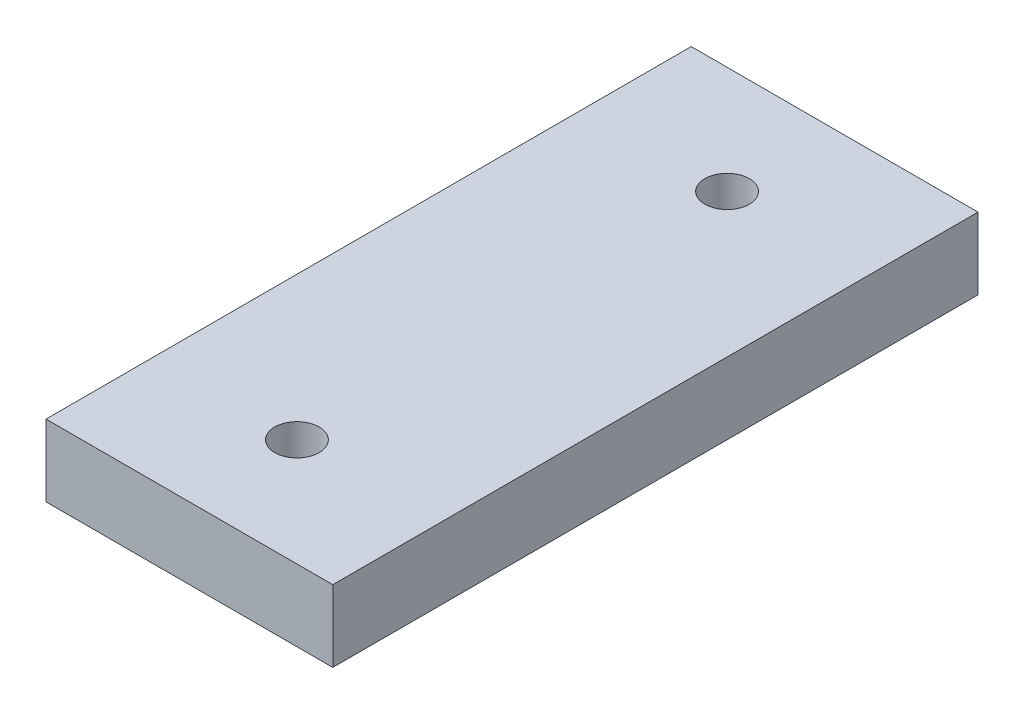
ISO-10303-21;
HEADER;
FILE_DESCRIPTION(('STEP AP214'),'2;1');
FILE_NAME('part.step','',(''),(''),'','','');
FILE_SCHEMA(('AUTOMOTIVE_DESIGN { 1 0 10303 214 1 1 1 1 }'));
ENDSEC;
DATA;
#1=APPLICATION_CONTEXT('core data for automotive mechanical design processes');
#2=APPLICATION_PROTOCOL_DEFINITION('international standard','automotive_design',2000,#1);
#3=PRODUCT_CONTEXT('',#1,'mechanical');
#4=PRODUCT('Part','Part','',(#3));
#5=PRODUCT_RELATED_PRODUCT_CATEGORY('part','',(#4));
#6=PRODUCT_DEFINITION_FORMATION('','',#4);
#7=PRODUCT_DEFINITION_CONTEXT('part definition',#1,'design');
#8=PRODUCT_DEFINITION('design','',#6,#7);
#9=PRODUCT_DEFINITION_SHAPE('','',#8);
#10=(LENGTH_UNIT() NAMED_UNIT(*) SI_UNIT(.MILLI.,.METRE.));
#11=(NAMED_UNIT(*) PLANE_ANGLE_UNIT() SI_UNIT($,.RADIAN.));
#12=(NAMED_UNIT(*) SI_UNIT($,.STERADIAN.) SOLID_ANGLE_UNIT());
#13=UNCERTAINTY_MEASURE_WITH_UNIT(LENGTH_MEASURE(1.E-05),#10,'distance_accuracy_value','');
#14=(GEOMETRIC_REPRESENTATION_CONTEXT(3) GLOBAL_UNCERTAINTY_ASSIGNED_CONTEXT((#13)) GLOBAL_UNIT_ASSIGNED_CONTEXT((#10,
#11,#12)) REPRESENTATION_CONTEXT('',''));
#15=CARTESIAN_POINT('',(0.,0.,0.));
#16=DIRECTION('',(0.,0.,1.));
#17=DIRECTION('',(1.,0.,0.));
#18=AXIS2_PLACEMENT_3D('',#15,#16,#17);
#19=CARTESIAN_POINT('',(10.,5.,22.5));
#20=DIRECTION('',(-1.,0.,0.));
#21=DIRECTION('',(0.,0.,1.));
#22=AXIS2_PLACEMENT_3D('',#19,#20,#21);
#23=PLANE('',#22);
#24=DIRECTION('',(0.,0.,-1.));
#25=VECTOR('',#24,1.);
#26=CARTESIAN_POINT('',(10.,0.,22.5));
#27=LINE('',#26,#25);
#28=CARTESIAN_POINT('',(10.,0.,22.5));
#29=VERTEX_POINT('',#28);
#30=CARTESIAN_POINT('',(10.,0.,-22.5));
#31=VERTEX_POINT('',#30);
#32=EDGE_CURVE('E97',#29,#31,#27,.T.);
#33=ORIENTED_EDGE('',*,*,#32,.T.);
#34=DIRECTION('',(0.,-1.,0.));
#35=VECTOR('',#34,1.);
#36=CARTESIAN_POINT('',(10.,5.,-22.5));
#37=LINE('',#36,#35);
#38=CARTESIAN_POINT('',(10.,5.,-22.5));
#39=VERTEX_POINT('',#38);
#40=EDGE_CURVE('E11',#39,#31,#37,.T.);
#41=ORIENTED_EDGE('',*,*,#40,.F.);
#42=DIRECTION('',(0.,0.,-1.));
#43=VECTOR('',#42,1.);
#44=CARTESIAN_POINT('',(10.,5.,22.5));
#45=LINE('',#44,#43);
#46=CARTESIAN_POINT('',(10.,5.,22.5));
#47=VERTEX_POINT('',#46);
#48=EDGE_CURVE('E85',#47,#39,#45,.T.);
#49=ORIENTED_EDGE('',*,*,#48,.F.);
#50=DIRECTION('',(0.,-1.,0.));
#51=VECTOR('',#50,1.);
#52=CARTESIAN_POINT('',(10.,5.,22.5));
#53=LINE('',#52,#51);
#54=EDGE_CURVE('E93',#47,#29,#53,.T.);
#55=ORIENTED_EDGE('',*,*,#54,.T.);
#56=EDGE_LOOP('',(#33,#41,#49,#55));
#57=FACE_BOUND('',#56,.T.);
#58=ADVANCED_FACE('F34',(#57),#23,.F.);
#59=CARTESIAN_POINT('',(-10.,5.,-22.5));
#60=DIRECTION('',(0.,0.,1.));
#61=DIRECTION('',(1.,0.,0.));
#62=AXIS2_PLACEMENT_3D('',#59,#60,#61);
#63=PLANE('',#62);
#64=DIRECTION('',(-1.,0.,0.));
#65=VECTOR('',#64,1.);
#66=CARTESIAN_POINT('',(-10.,0.,-22.5));
#67=LINE('',#66,#65);
#68=CARTESIAN_POINT('',(-10.,0.,-22.5));
#69=VERTEX_POINT('',#68);
#70=EDGE_CURVE('E89',#31,#69,#67,.T.);
#71=ORIENTED_EDGE('',*,*,#70,.T.);
#72=DIRECTION('',(0.,-1.,0.));
#73=VECTOR('',#72,1.);
#74=CARTESIAN_POINT('',(-10.,5.,-22.5));
#75=LINE('',#74,#73);
#76=CARTESIAN_POINT('',(-10.,5.,-22.5));
#77=VERTEX_POINT('',#76);
#78=EDGE_CURVE('E42',#77,#69,#75,.T.);
#79=ORIENTED_EDGE('',*,*,#78,.F.);
#80=DIRECTION('',(-1.,0.,0.));
#81=VECTOR('',#80,1.);
#82=CARTESIAN_POINT('',(-10.,5.,-22.5));
#83=LINE('',#82,#81);
#84=EDGE_CURVE('E80',#39,#77,#83,.T.);
#85=ORIENTED_EDGE('',*,*,#84,.F.);
#86=ORIENTED_EDGE('',*,*,#40,.T.);
#87=EDGE_LOOP('',(#71,#79,#85,#86));
#88=FACE_BOUND('',#87,.T.);
#89=ADVANCED_FACE('F88',(#88),#63,.F.);
#90=CARTESIAN_POINT('',(-10.,5.,22.5));
#91=DIRECTION('',(1.,0.,0.));
#92=DIRECTION('',(0.,0.,-1.));
#93=AXIS2_PLACEMENT_3D('',#90,#91,#92);
#94=PLANE('',#93);
#95=DIRECTION('',(0.,0.,1.));
#96=VECTOR('',#95,1.);
#97=CARTESIAN_POINT('',(-10.,0.,22.5));
#98=LINE('',#97,#96);
#99=CARTESIAN_POINT('',(-10.,0.,22.5));
#100=VERTEX_POINT('',#99);
#101=EDGE_CURVE('E67',#69,#100,#98,.T.);
#102=ORIENTED_EDGE('',*,*,#101,.T.);
#103=DIRECTION('',(0.,-1.,0.));
#104=VECTOR('',#103,1.);
#105=CARTESIAN_POINT('',(-10.,5.,22.5));
#106=LINE('',#105,#104);
#107=CARTESIAN_POINT('',(-10.,5.,22.5));
#108=VERTEX_POINT('',#107);
#109=EDGE_CURVE('E90',#108,#100,#106,.T.);
#110=ORIENTED_EDGE('',*,*,#109,.F.);
#111=DIRECTION('',(0.,0.,1.));
#112=VECTOR('',#111,1.);
#113=CARTESIAN_POINT('',(-10.,5.,22.5));
#114=LINE('',#113,#112);
#115=EDGE_CURVE('E83',#77,#108,#114,.T.);
#116=ORIENTED_EDGE('',*,*,#115,.F.);
#117=ORIENTED_EDGE('',*,*,#78,.T.);
#118=EDGE_LOOP('',(#102,#110,#116,#117));
#119=FACE_BOUND('',#118,.T.);
#120=ADVANCED_FACE('F91',(#119),#94,.F.);
#121=CARTESIAN_POINT('',(-10.,5.,22.5));
#122=DIRECTION('',(0.,0.,-1.));
#123=DIRECTION('',(-1.,0.,0.));
#124=AXIS2_PLACEMENT_3D('',#121,#122,#123);
#125=PLANE('',#124);
#126=DIRECTION('',(1.,0.,0.));
#127=VECTOR('',#126,1.);
#128=CARTESIAN_POINT('',(-10.,0.,22.5));
#129=LINE('',#128,#127);
#130=EDGE_CURVE('E73',#100,#29,#129,.T.);
#131=ORIENTED_EDGE('',*,*,#130,.T.);
#132=ORIENTED_EDGE('',*,*,#54,.F.);
#133=DIRECTION('',(1.,0.,0.));
#134=VECTOR('',#133,1.);
#135=CARTESIAN_POINT('',(-10.,5.,22.5));
#136=LINE('',#135,#134);
#137=EDGE_CURVE('E50',#108,#47,#136,.T.);
#138=ORIENTED_EDGE('',*,*,#137,.F.);
#139=ORIENTED_EDGE('',*,*,#109,.T.);
#140=EDGE_LOOP('',(#131,#132,#138,#139));
#141=FACE_BOUND('',#140,.T.);
#142=ADVANCED_FACE('F105',(#141),#125,.F.);
#143=CARTESIAN_POINT('',(0.,5.,0.));
#144=DIRECTION('',(0.,-1.,0.));
#145=DIRECTION('',(0.,0.,-1.));
#146=AXIS2_PLACEMENT_3D('',#143,#144,#145);
#147=PLANE('',#146);
#148=CARTESIAN_POINT('',(0.,5.,-15.));
#149=DIRECTION('',(0.,1.,0.));
#150=DIRECTION('',(0.,0.,1.));
#151=AXIS2_PLACEMENT_3D('',#148,#149,#150);
#152=CIRCLE('',#151,1.55);
#153=CARTESIAN_POINT('',(0.,5.,-13.45));
#154=VERTEX_POINT('',#153);
#155=EDGE_CURVE('E117',#154,#154,#152,.T.);
#156=ORIENTED_EDGE('',*,*,#155,.F.);
#157=EDGE_LOOP('',(#156));
#158=FACE_BOUND('',#157,.T.);
#159=CARTESIAN_POINT('',(0.,5.,15.));
#160=DIRECTION('',(0.,1.,0.));
#161=DIRECTION('',(0.,0.,-1.));
#162=AXIS2_PLACEMENT_3D('',#159,#160,#161);
#163=CIRCLE('',#162,1.55);
#164=CARTESIAN_POINT('',(0.,5.,13.45));
#165=VERTEX_POINT('',#164);
#166=EDGE_CURVE('E111',#165,#165,#163,.T.);
#167=ORIENTED_EDGE('',*,*,#166,.F.);
#168=EDGE_LOOP('',(#167));
#169=FACE_BOUND('',#168,.T.);
#170=ORIENTED_EDGE('',*,*,#48,.T.);
#171=ORIENTED_EDGE('',*,*,#84,.T.);
#172=ORIENTED_EDGE('',*,*,#115,.T.);
#173=ORIENTED_EDGE('',*,*,#137,.T.);
#174=EDGE_LOOP('',(#170,#171,#172,#173));
#175=FACE_BOUND('',#174,.T.);
#176=ADVANCED_FACE('F81',(#158,#169,#175),#147,.F.);
#177=CARTESIAN_POINT('',(0.,0.,0.));
#178=DIRECTION('',(0.,-1.,0.));
#179=DIRECTION('',(0.,0.,-1.));
#180=AXIS2_PLACEMENT_3D('',#177,#178,#179);
#181=PLANE('',#180);
#182=CARTESIAN_POINT('',(0.,0.,-15.));
#183=DIRECTION('',(0.,1.,0.));
#184=DIRECTION('',(0.,0.,1.));
#185=AXIS2_PLACEMENT_3D('',#182,#183,#184);
#186=CIRCLE('',#185,1.55);
#187=CARTESIAN_POINT('',(0.,0.,-13.45));
#188=VERTEX_POINT('',#187);
#189=EDGE_CURVE('E100',#188,#188,#186,.T.);
#190=ORIENTED_EDGE('',*,*,#189,.T.);
#191=EDGE_LOOP('',(#190));
#192=FACE_BOUND('',#191,.T.);
#193=CARTESIAN_POINT('',(0.,0.,15.));
#194=DIRECTION('',(0.,1.,0.));
#195=DIRECTION('',(0.,0.,-1.));
#196=AXIS2_PLACEMENT_3D('',#193,#194,#195);
#197=CIRCLE('',#196,1.55);
#198=CARTESIAN_POINT('',(0.,0.,13.45));
#199=VERTEX_POINT('',#198);
#200=EDGE_CURVE('E114',#199,#199,#197,.T.);
#201=ORIENTED_EDGE('',*,*,#200,.T.);
#202=EDGE_LOOP('',(#201));
#203=FACE_BOUND('',#202,.T.);
#204=ORIENTED_EDGE('',*,*,#32,.F.);
#205=ORIENTED_EDGE('',*,*,#130,.F.);
#206=ORIENTED_EDGE('',*,*,#101,.F.);
#207=ORIENTED_EDGE('',*,*,#70,.F.);
#208=EDGE_LOOP('',(#204,#205,#206,#207));
#209=FACE_BOUND('',#208,.T.);
#210=ADVANCED_FACE('F108',(#192,#203,#209),#181,.T.);
#211=CARTESIAN_POINT('',(0.,0.,15.));
#212=DIRECTION('',(0.,1.,0.));
#213=DIRECTION('',(0.,0.,1.));
#214=AXIS2_PLACEMENT_3D('',#211,#212,#213);
#215=CYLINDRICAL_SURFACE('',#214,1.55);
#216=ORIENTED_EDGE('',*,*,#200,.F.);
#217=EDGE_LOOP('',(#216));
#218=FACE_BOUND('',#217,.T.);
#219=ORIENTED_EDGE('',*,*,#166,.T.);
#220=EDGE_LOOP('',(#219));
#221=FACE_BOUND('',#220,.T.);
#222=ADVANCED_FACE('F128',(#218,#221),#215,.F.);
#223=CARTESIAN_POINT('',(0.,0.,-15.));
#224=DIRECTION('',(0.,1.,0.));
#225=DIRECTION('',(0.,0.,1.));
#226=AXIS2_PLACEMENT_3D('',#223,#224,#225);
#227=CYLINDRICAL_SURFACE('',#226,1.55);
#228=ORIENTED_EDGE('',*,*,#189,.F.);
#229=EDGE_LOOP('',(#228));
#230=FACE_BOUND('',#229,.T.);
#231=ORIENTED_EDGE('',*,*,#155,.T.);
#232=EDGE_LOOP('',(#231));
#233=FACE_BOUND('',#232,.T.);
#234=ADVANCED_FACE('F125',(#230,#233),#227,.F.);
#235=CLOSED_SHELL('',(#58,#89,#120,#142,#176,#210,#222,#234));
#236=MANIFOLD_SOLID_BREP('B2',#235);
#237=ADVANCED_BREP_SHAPE_REPRESENTATION('',(#18,#236),#14);
#238=SHAPE_DEFINITION_REPRESENTATION(#9,#237);
ENDSEC;
END-ISO-10303-21;
